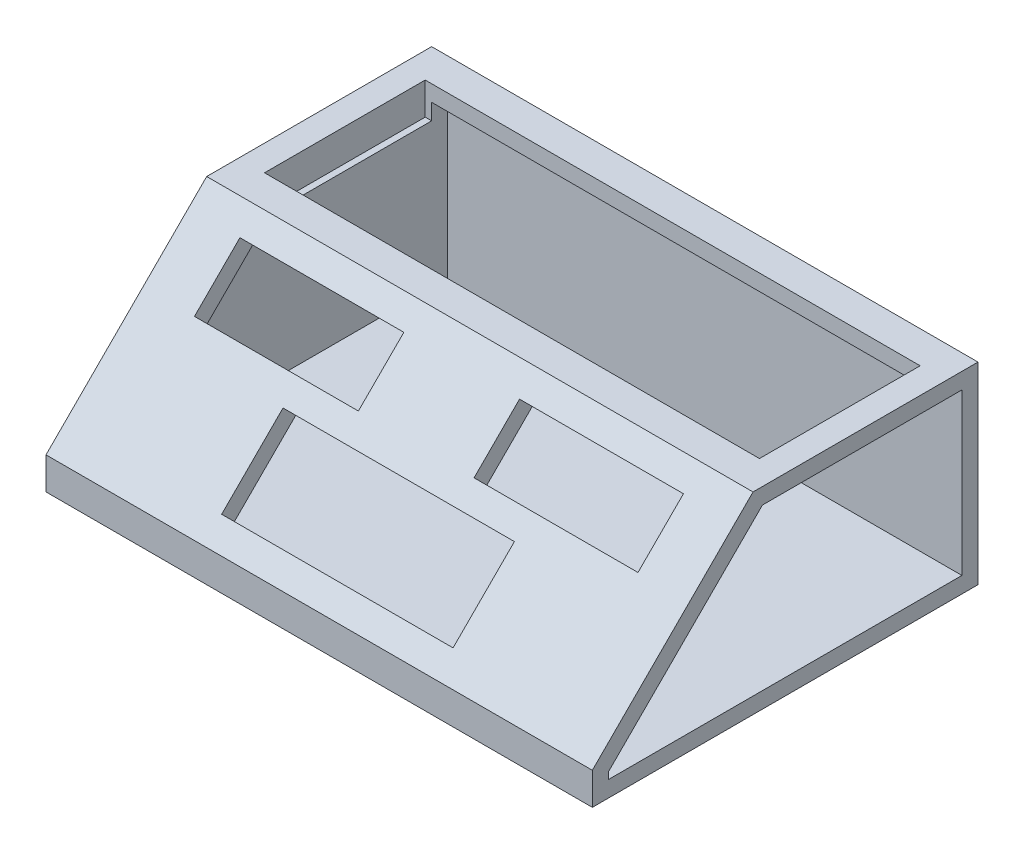
ISO-10303-21;
HEADER;
FILE_DESCRIPTION(('STEP AP214'),'2;1');
FILE_NAME('part.step','',(''),(''),'','','');
FILE_SCHEMA(('AUTOMOTIVE_DESIGN { 1 0 10303 214 1 1 1 1 }'));
ENDSEC;
DATA;
#1=APPLICATION_CONTEXT('core data for automotive mechanical design processes');
#2=APPLICATION_PROTOCOL_DEFINITION('international standard','automotive_design',2000,#1);
#3=PRODUCT_CONTEXT('',#1,'mechanical');
#4=PRODUCT('Part','Part','',(#3));
#5=PRODUCT_RELATED_PRODUCT_CATEGORY('part','',(#4));
#6=PRODUCT_DEFINITION_FORMATION('','',#4);
#7=PRODUCT_DEFINITION_CONTEXT('part definition',#1,'design');
#8=PRODUCT_DEFINITION('design','',#6,#7);
#9=PRODUCT_DEFINITION_SHAPE('','',#8);
#10=(LENGTH_UNIT() NAMED_UNIT(*) SI_UNIT(.MILLI.,.METRE.));
#11=(NAMED_UNIT(*) PLANE_ANGLE_UNIT() SI_UNIT($,.RADIAN.));
#12=(NAMED_UNIT(*) SI_UNIT($,.STERADIAN.) SOLID_ANGLE_UNIT());
#13=UNCERTAINTY_MEASURE_WITH_UNIT(LENGTH_MEASURE(1.E-05),#10,'distance_accuracy_value','');
#14=(GEOMETRIC_REPRESENTATION_CONTEXT(3) GLOBAL_UNCERTAINTY_ASSIGNED_CONTEXT((#13)) GLOBAL_UNIT_ASSIGNED_CONTEXT((#10,
#11,#12)) REPRESENTATION_CONTEXT('',''));
#15=CARTESIAN_POINT('',(0.,0.,0.));
#16=DIRECTION('',(0.,0.,1.));
#17=DIRECTION('',(1.,0.,0.));
#18=AXIS2_PLACEMENT_3D('',#15,#16,#17);
#19=CARTESIAN_POINT('',(0.,18.1393825594359,0.));
#20=DIRECTION('',(0.,1.,0.));
#21=DIRECTION('',(0.,0.,1.));
#22=AXIS2_PLACEMENT_3D('',#19,#20,#21);
#23=PLANE('',#22);
#24=DIRECTION('',(1.,0.,0.));
#25=VECTOR('',#24,1.);
#26=CARTESIAN_POINT('',(8.00000000000001,18.1393825594359,44.3239706504555));
#27=LINE('',#26,#25);
#28=CARTESIAN_POINT('',(8.00000000000001,18.1393825594359,44.3239706504555));
#29=VERTEX_POINT('',#28);
#30=CARTESIAN_POINT('',(10.,18.1393825594359,44.3239706504555));
#31=VERTEX_POINT('',#30);
#32=EDGE_CURVE('E343',#29,#31,#27,.T.);
#33=ORIENTED_EDGE('',*,*,#32,.T.);
#34=DIRECTION('',(0.,0.,-1.));
#35=VECTOR('',#34,1.);
#36=CARTESIAN_POINT('',(10.,18.1393825594359,0.));
#37=LINE('',#36,#35);
#38=CARTESIAN_POINT('',(10.,18.1393825594359,-5.67602934954452));
#39=VERTEX_POINT('',#38);
#40=EDGE_CURVE('E404',#31,#39,#37,.T.);
#41=ORIENTED_EDGE('',*,*,#40,.T.);
#42=DIRECTION('',(-1.,0.,0.));
#43=VECTOR('',#42,1.);
#44=CARTESIAN_POINT('',(8.,18.1393825594359,-5.67602934954452));
#45=LINE('',#44,#43);
#46=CARTESIAN_POINT('',(8.,18.1393825594359,-5.67602934954452));
#47=VERTEX_POINT('',#46);
#48=EDGE_CURVE('E347',#39,#47,#45,.T.);
#49=ORIENTED_EDGE('',*,*,#48,.T.);
#50=DIRECTION('',(0.,0.,1.));
#51=VECTOR('',#50,1.);
#52=CARTESIAN_POINT('',(8.,18.1393825594359,-5.67602934954452));
#53=LINE('',#52,#51);
#54=EDGE_CURVE('E340',#47,#29,#53,.T.);
#55=ORIENTED_EDGE('',*,*,#54,.T.);
#56=EDGE_LOOP('',(#33,#41,#49,#55));
#57=FACE_BOUND('',#56,.T.);
#58=ADVANCED_FACE('F33',(#57),#23,.T.);
#59=CARTESIAN_POINT('',(170.,-21.8606174405641,104.323970650455));
#60=DIRECTION('',(0.,-0.707106781186547,-0.707106781186548));
#61=DIRECTION('',(0.,0.707106781186548,-0.707106781186547));
#62=AXIS2_PLACEMENT_3D('',#59,#60,#61);
#63=PLANE('',#62);
#64=DIRECTION('',(1.,0.,0.));
#65=VECTOR('',#64,1.);
#66=CARTESIAN_POINT('',(103.,8.34039268621256,74.1229605236788));
#67=LINE('',#66,#65);
#68=CARTESIAN_POINT('',(103.,8.34039268621257,74.1229605236788));
#69=VERTEX_POINT('',#68);
#70=CARTESIAN_POINT('',(154.,8.34039268621256,74.1229605236788));
#71=VERTEX_POINT('',#70);
#72=EDGE_CURVE('E251',#69,#71,#67,.T.);
#73=ORIENTED_EDGE('',*,*,#72,.F.);
#74=DIRECTION('',(0.,-0.707106781186548,0.707106781186547));
#75=VECTOR('',#74,1.);
#76=CARTESIAN_POINT('',(103.,22.4825283099435,59.9808248999479));
#77=LINE('',#76,#75);
#78=CARTESIAN_POINT('',(103.,22.4825283099435,59.9808248999479));
#79=VERTEX_POINT('',#78);
#80=EDGE_CURVE('E48',#79,#69,#77,.T.);
#81=ORIENTED_EDGE('',*,*,#80,.F.);
#82=DIRECTION('',(-1.,0.,0.));
#83=VECTOR('',#82,1.);
#84=CARTESIAN_POINT('',(103.,22.4825283099435,59.9808248999479));
#85=LINE('',#84,#83);
#86=CARTESIAN_POINT('',(154.,22.4825283099435,59.9808248999479));
#87=VERTEX_POINT('',#86);
#88=EDGE_CURVE('E257',#87,#79,#85,.T.);
#89=ORIENTED_EDGE('',*,*,#88,.F.);
#90=DIRECTION('',(0.,0.707106781186548,-0.707106781186547));
#91=VECTOR('',#90,1.);
#92=CARTESIAN_POINT('',(154.,22.4825283099435,59.9808248999479));
#93=LINE('',#92,#91);
#94=EDGE_CURVE('E254',#71,#87,#93,.T.);
#95=ORIENTED_EDGE('',*,*,#94,.F.);
#96=EDGE_LOOP('',(#73,#81,#89,#95));
#97=FACE_BOUND('',#96,.T.);
#98=DIRECTION('',(1.,0.,0.));
#99=VECTOR('',#98,1.);
#100=CARTESIAN_POINT('',(49.,-16.2037631910717,98.6671164009631));
#101=LINE('',#100,#99);
#102=CARTESIAN_POINT('',(49.,-16.2037631910717,98.6671164009631));
#103=VERTEX_POINT('',#102);
#104=CARTESIAN_POINT('',(121.,-16.2037631910717,98.6671164009631));
#105=VERTEX_POINT('',#104);
#106=EDGE_CURVE('E235',#103,#105,#101,.T.);
#107=ORIENTED_EDGE('',*,*,#106,.F.);
#108=DIRECTION('',(0.,-0.707106781186547,0.707106781186547));
#109=VECTOR('',#108,1.);
#110=CARTESIAN_POINT('',(49.,2.88811990096507,79.5752333089263));
#111=LINE('',#110,#109);
#112=CARTESIAN_POINT('',(49.,2.88811990096507,79.5752333089263));
#113=VERTEX_POINT('',#112);
#114=EDGE_CURVE('E56',#113,#103,#111,.T.);
#115=ORIENTED_EDGE('',*,*,#114,.F.);
#116=DIRECTION('',(-1.,0.,0.));
#117=VECTOR('',#116,1.);
#118=CARTESIAN_POINT('',(49.,2.88811990096507,79.5752333089263));
#119=LINE('',#118,#117);
#120=CARTESIAN_POINT('',(121.,2.88811990096507,79.5752333089263));
#121=VERTEX_POINT('',#120);
#122=EDGE_CURVE('E241',#121,#113,#119,.T.);
#123=ORIENTED_EDGE('',*,*,#122,.F.);
#124=DIRECTION('',(0.,0.707106781186547,-0.707106781186547));
#125=VECTOR('',#124,1.);
#126=CARTESIAN_POINT('',(121.,2.88811990096507,79.5752333089263));
#127=LINE('',#126,#125);
#128=EDGE_CURVE('E225',#105,#121,#127,.T.);
#129=ORIENTED_EDGE('',*,*,#128,.F.);
#130=EDGE_LOOP('',(#107,#115,#123,#129));
#131=FACE_BOUND('',#130,.T.);
#132=DIRECTION('',(1.,0.,0.));
#133=VECTOR('',#132,1.);
#134=CARTESIAN_POINT('',(16.,8.34039268621256,74.1229605236788));
#135=LINE('',#134,#133);
#136=CARTESIAN_POINT('',(16.,8.34039268621257,74.1229605236788));
#137=VERTEX_POINT('',#136);
#138=CARTESIAN_POINT('',(67.,8.34039268621256,74.1229605236788));
#139=VERTEX_POINT('',#138);
#140=EDGE_CURVE('E270',#137,#139,#135,.T.);
#141=ORIENTED_EDGE('',*,*,#140,.F.);
#142=DIRECTION('',(0.,-0.707106781186548,0.707106781186547));
#143=VECTOR('',#142,1.);
#144=CARTESIAN_POINT('',(16.,22.4825283099435,59.9808248999479));
#145=LINE('',#144,#143);
#146=CARTESIAN_POINT('',(16.,22.4825283099435,59.9808248999479));
#147=VERTEX_POINT('',#146);
#148=EDGE_CURVE('E263',#147,#137,#145,.T.);
#149=ORIENTED_EDGE('',*,*,#148,.F.);
#150=DIRECTION('',(-1.,0.,0.));
#151=VECTOR('',#150,1.);
#152=CARTESIAN_POINT('',(16.,22.4825283099435,59.9808248999479));
#153=LINE('',#152,#151);
#154=CARTESIAN_POINT('',(67.,22.4825283099435,59.9808248999479));
#155=VERTEX_POINT('',#154);
#156=EDGE_CURVE('E276',#155,#147,#153,.T.);
#157=ORIENTED_EDGE('',*,*,#156,.F.);
#158=DIRECTION('',(0.,0.707106781186548,-0.707106781186547));
#159=VECTOR('',#158,1.);
#160=CARTESIAN_POINT('',(67.,22.4825283099435,59.9808248999479));
#161=LINE('',#160,#159);
#162=EDGE_CURVE('E273',#139,#155,#161,.T.);
#163=ORIENTED_EDGE('',*,*,#162,.F.);
#164=EDGE_LOOP('',(#141,#149,#157,#163));
#165=FACE_BOUND('',#164,.T.);
#166=DIRECTION('',(0.,-0.707106781186548,0.707106781186547));
#167=VECTOR('',#166,1.);
#168=CARTESIAN_POINT('',(0.,-21.8606174405641,104.323970650455));
#169=LINE('',#168,#167);
#170=CARTESIAN_POINT('',(0.,28.1393825594359,54.3239706504555));
#171=VERTEX_POINT('',#170);
#172=CARTESIAN_POINT('',(0.,-21.8606174405641,104.323970650455));
#173=VERTEX_POINT('',#172);
#174=EDGE_CURVE('E361',#171,#173,#169,.T.);
#175=ORIENTED_EDGE('',*,*,#174,.T.);
#176=DIRECTION('',(-1.,0.,0.));
#177=VECTOR('',#176,1.);
#178=CARTESIAN_POINT('',(170.,-21.8606174405641,104.323970650455));
#179=LINE('',#178,#177);
#180=CARTESIAN_POINT('',(170.,-21.8606174405641,104.323970650455));
#181=VERTEX_POINT('',#180);
#182=EDGE_CURVE('E401',#181,#173,#179,.T.);
#183=ORIENTED_EDGE('',*,*,#182,.F.);
#184=DIRECTION('',(0.,-0.707106781186548,0.707106781186547));
#185=VECTOR('',#184,1.);
#186=CARTESIAN_POINT('',(170.,-21.8606174405641,104.323970650455));
#187=LINE('',#186,#185);
#188=CARTESIAN_POINT('',(170.,28.1393825594359,54.3239706504555));
#189=VERTEX_POINT('',#188);
#190=EDGE_CURVE('E368',#189,#181,#187,.T.);
#191=ORIENTED_EDGE('',*,*,#190,.F.);
#192=DIRECTION('',(-1.,0.,0.));
#193=VECTOR('',#192,1.);
#194=CARTESIAN_POINT('',(170.,28.1393825594359,54.3239706504555));
#195=LINE('',#194,#193);
#196=EDGE_CURVE('E380',#189,#171,#195,.T.);
#197=ORIENTED_EDGE('',*,*,#196,.T.);
#198=EDGE_LOOP('',(#175,#183,#191,#197));
#199=FACE_BOUND('',#198,.T.);
#200=ADVANCED_FACE('F35',(#97,#131,#165,#199),#63,.F.);
#201=CARTESIAN_POINT('',(170.,-31.8606174405641,104.323970650455));
#202=DIRECTION('',(0.,0.,-1.));
#203=DIRECTION('',(-1.,0.,0.));
#204=AXIS2_PLACEMENT_3D('',#201,#202,#203);
#205=PLANE('',#204);
#206=DIRECTION('',(0.,-1.,0.));
#207=VECTOR('',#206,1.);
#208=CARTESIAN_POINT('',(0.,-31.8606174405641,104.323970650455));
#209=LINE('',#208,#207);
#210=CARTESIAN_POINT('',(0.,-31.8606174405641,104.323970650455));
#211=VERTEX_POINT('',#210);
#212=EDGE_CURVE('E383',#173,#211,#209,.T.);
#213=ORIENTED_EDGE('',*,*,#212,.T.);
#214=DIRECTION('',(-1.,0.,0.));
#215=VECTOR('',#214,1.);
#216=CARTESIAN_POINT('',(170.,-31.8606174405641,104.323970650455));
#217=LINE('',#216,#215);
#218=CARTESIAN_POINT('',(170.,-31.8606174405641,104.323970650455));
#219=VERTEX_POINT('',#218);
#220=EDGE_CURVE('E398',#219,#211,#217,.T.);
#221=ORIENTED_EDGE('',*,*,#220,.F.);
#222=DIRECTION('',(0.,-1.,0.));
#223=VECTOR('',#222,1.);
#224=CARTESIAN_POINT('',(170.,-31.8606174405641,104.323970650455));
#225=LINE('',#224,#223);
#226=EDGE_CURVE('E371',#181,#219,#225,.T.);
#227=ORIENTED_EDGE('',*,*,#226,.F.);
#228=ORIENTED_EDGE('',*,*,#182,.T.);
#229=EDGE_LOOP('',(#213,#221,#227,#228));
#230=FACE_BOUND('',#229,.T.);
#231=ADVANCED_FACE('F470',(#230),#205,.F.);
#232=CARTESIAN_POINT('',(170.,-31.8606174405641,-15.6760293495445));
#233=DIRECTION('',(0.,1.,0.));
#234=DIRECTION('',(0.,0.,1.));
#235=AXIS2_PLACEMENT_3D('',#232,#233,#234);
#236=PLANE('',#235);
#237=DIRECTION('',(0.,0.,-1.));
#238=VECTOR('',#237,1.);
#239=CARTESIAN_POINT('',(0.,-31.8606174405641,-15.6760293495445));
#240=LINE('',#239,#238);
#241=CARTESIAN_POINT('',(0.,-31.8606174405641,-15.6760293495445));
#242=VERTEX_POINT('',#241);
#243=EDGE_CURVE('E385',#211,#242,#240,.T.);
#244=ORIENTED_EDGE('',*,*,#243,.T.);
#245=DIRECTION('',(-1.,0.,0.));
#246=VECTOR('',#245,1.);
#247=CARTESIAN_POINT('',(170.,-31.8606174405641,-15.6760293495445));
#248=LINE('',#247,#246);
#249=CARTESIAN_POINT('',(170.,-31.8606174405641,-15.6760293495445));
#250=VERTEX_POINT('',#249);
#251=EDGE_CURVE('E395',#250,#242,#248,.T.);
#252=ORIENTED_EDGE('',*,*,#251,.F.);
#253=DIRECTION('',(0.,0.,-1.));
#254=VECTOR('',#253,1.);
#255=CARTESIAN_POINT('',(170.,-31.8606174405641,-15.6760293495445));
#256=LINE('',#255,#254);
#257=EDGE_CURVE('E374',#219,#250,#256,.T.);
#258=ORIENTED_EDGE('',*,*,#257,.F.);
#259=ORIENTED_EDGE('',*,*,#220,.T.);
#260=EDGE_LOOP('',(#244,#252,#258,#259));
#261=FACE_BOUND('',#260,.T.);
#262=ADVANCED_FACE('F506',(#261),#236,.F.);
#263=CARTESIAN_POINT('',(170.,28.1393825594359,-15.6760293495445));
#264=DIRECTION('',(0.,0.,1.));
#265=DIRECTION('',(0.,-1.,0.));
#266=AXIS2_PLACEMENT_3D('',#263,#264,#265);
#267=PLANE('',#266);
#268=DIRECTION('',(0.,1.,0.));
#269=VECTOR('',#268,1.);
#270=CARTESIAN_POINT('',(0.,28.1393825594359,-15.6760293495445));
#271=LINE('',#270,#269);
#272=CARTESIAN_POINT('',(0.,28.1393825594359,-15.6760293495445));
#273=VERTEX_POINT('',#272);
#274=EDGE_CURVE('E387',#242,#273,#271,.T.);
#275=ORIENTED_EDGE('',*,*,#274,.T.);
#276=DIRECTION('',(-1.,0.,0.));
#277=VECTOR('',#276,1.);
#278=CARTESIAN_POINT('',(170.,28.1393825594359,-15.6760293495445));
#279=LINE('',#278,#277);
#280=CARTESIAN_POINT('',(170.,28.1393825594359,-15.6760293495445));
#281=VERTEX_POINT('',#280);
#282=EDGE_CURVE('E392',#281,#273,#279,.T.);
#283=ORIENTED_EDGE('',*,*,#282,.F.);
#284=DIRECTION('',(0.,1.,0.));
#285=VECTOR('',#284,1.);
#286=CARTESIAN_POINT('',(170.,28.1393825594359,-15.6760293495445));
#287=LINE('',#286,#285);
#288=EDGE_CURVE('E376',#250,#281,#287,.T.);
#289=ORIENTED_EDGE('',*,*,#288,.F.);
#290=ORIENTED_EDGE('',*,*,#251,.T.);
#291=EDGE_LOOP('',(#275,#283,#289,#290));
#292=FACE_BOUND('',#291,.T.);
#293=ADVANCED_FACE('F502',(#292),#267,.F.);
#294=CARTESIAN_POINT('',(170.,28.1393825594359,54.3239706504555));
#295=DIRECTION('',(0.,-1.,0.));
#296=DIRECTION('',(0.,0.,-1.));
#297=AXIS2_PLACEMENT_3D('',#294,#295,#296);
#298=PLANE('',#297);
#299=DIRECTION('',(1.,0.,0.));
#300=VECTOR('',#299,1.);
#301=CARTESIAN_POINT('',(8.00000000000001,28.1393825594359,44.3239706504555));
#302=LINE('',#301,#300);
#303=CARTESIAN_POINT('',(8.00000000000001,28.1393825594359,44.3239706504555));
#304=VERTEX_POINT('',#303);
#305=CARTESIAN_POINT('',(162.,28.1393825594359,44.3239706504555));
#306=VERTEX_POINT('',#305);
#307=EDGE_CURVE('E351',#304,#306,#302,.T.);
#308=ORIENTED_EDGE('',*,*,#307,.F.);
#309=DIRECTION('',(0.,0.,1.));
#310=VECTOR('',#309,1.);
#311=CARTESIAN_POINT('',(8.,28.1393825594359,-5.67602934954452));
#312=LINE('',#311,#310);
#313=CARTESIAN_POINT('',(8.,28.1393825594359,-5.67602934954452));
#314=VERTEX_POINT('',#313);
#315=EDGE_CURVE('E339',#314,#304,#312,.T.);
#316=ORIENTED_EDGE('',*,*,#315,.F.);
#317=DIRECTION('',(-1.,0.,0.));
#318=VECTOR('',#317,1.);
#319=CARTESIAN_POINT('',(8.,28.1393825594359,-5.67602934954452));
#320=LINE('',#319,#318);
#321=CARTESIAN_POINT('',(162.,28.1393825594359,-5.67602934954452));
#322=VERTEX_POINT('',#321);
#323=EDGE_CURVE('E344',#322,#314,#320,.T.);
#324=ORIENTED_EDGE('',*,*,#323,.F.);
#325=DIRECTION('',(0.,0.,-1.));
#326=VECTOR('',#325,1.);
#327=CARTESIAN_POINT('',(162.,28.1393825594359,-5.67602934954452));
#328=LINE('',#327,#326);
#329=EDGE_CURVE('E354',#306,#322,#328,.T.);
#330=ORIENTED_EDGE('',*,*,#329,.F.);
#331=EDGE_LOOP('',(#308,#316,#324,#330));
#332=FACE_BOUND('',#331,.T.);
#333=DIRECTION('',(0.,0.,1.));
#334=VECTOR('',#333,1.);
#335=CARTESIAN_POINT('',(0.,28.1393825594359,54.3239706504555));
#336=LINE('',#335,#334);
#337=EDGE_CURVE('E372',#273,#171,#336,.T.);
#338=ORIENTED_EDGE('',*,*,#337,.T.);
#339=ORIENTED_EDGE('',*,*,#196,.F.);
#340=DIRECTION('',(0.,0.,1.));
#341=VECTOR('',#340,1.);
#342=CARTESIAN_POINT('',(170.,28.1393825594359,54.3239706504555));
#343=LINE('',#342,#341);
#344=EDGE_CURVE('E378',#281,#189,#343,.T.);
#345=ORIENTED_EDGE('',*,*,#344,.F.);
#346=ORIENTED_EDGE('',*,*,#282,.T.);
#347=EDGE_LOOP('',(#338,#339,#345,#346));
#348=FACE_BOUND('',#347,.T.);
#349=ADVANCED_FACE('F495',(#332,#348),#298,.F.);
#350=CARTESIAN_POINT('',(170.,0.,0.));
#351=DIRECTION('',(-1.,0.,0.));
#352=DIRECTION('',(0.,0.,1.));
#353=AXIS2_PLACEMENT_3D('',#350,#351,#352);
#354=PLANE('',#353);
#355=DIRECTION('',(0.,-1.,0.));
#356=VECTOR('',#355,1.);
#357=CARTESIAN_POINT('',(170.,-24.7821574610261,99.3239706504555));
#358=LINE('',#357,#356);
#359=CARTESIAN_POINT('',(170.,-24.7821574610261,99.3239706504555));
#360=VERTEX_POINT('',#359);
#361=CARTESIAN_POINT('',(170.,-26.8606174405641,99.3239706504555));
#362=VERTEX_POINT('',#361);
#363=EDGE_CURVE('E308',#360,#362,#358,.T.);
#364=ORIENTED_EDGE('',*,*,#363,.F.);
#365=DIRECTION('',(0.,-0.707106781186554,0.707106781186541));
#366=VECTOR('',#365,1.);
#367=CARTESIAN_POINT('',(170.,23.1393825594359,51.4024306299943));
#368=LINE('',#367,#366);
#369=CARTESIAN_POINT('',(170.,23.1393825594359,51.4024306299943));
#370=VERTEX_POINT('',#369);
#371=EDGE_CURVE('E282',#370,#360,#368,.T.);
#372=ORIENTED_EDGE('',*,*,#371,.F.);
#373=DIRECTION('',(0.,0.,1.));
#374=VECTOR('',#373,1.);
#375=CARTESIAN_POINT('',(170.,23.1393825594359,51.4024306299943));
#376=LINE('',#375,#374);
#377=CARTESIAN_POINT('',(170.,23.1393825594359,-10.6760293495445));
#378=VERTEX_POINT('',#377);
#379=EDGE_CURVE('E293',#378,#370,#376,.T.);
#380=ORIENTED_EDGE('',*,*,#379,.F.);
#381=DIRECTION('',(0.,1.,0.));
#382=VECTOR('',#381,1.);
#383=CARTESIAN_POINT('',(170.,23.1393825594359,-10.6760293495445));
#384=LINE('',#383,#382);
#385=CARTESIAN_POINT('',(170.,-26.8606174405641,-10.6760293495445));
#386=VERTEX_POINT('',#385);
#387=EDGE_CURVE('E314',#386,#378,#384,.T.);
#388=ORIENTED_EDGE('',*,*,#387,.F.);
#389=DIRECTION('',(0.,0.,-1.));
#390=VECTOR('',#389,1.);
#391=CARTESIAN_POINT('',(170.,-26.8606174405641,-10.6760293495445));
#392=LINE('',#391,#390);
#393=EDGE_CURVE('E311',#362,#386,#392,.T.);
#394=ORIENTED_EDGE('',*,*,#393,.F.);
#395=EDGE_LOOP('',(#364,#372,#380,#388,#394));
#396=FACE_BOUND('',#395,.T.);
#397=ORIENTED_EDGE('',*,*,#190,.T.);
#398=ORIENTED_EDGE('',*,*,#226,.T.);
#399=ORIENTED_EDGE('',*,*,#257,.T.);
#400=ORIENTED_EDGE('',*,*,#288,.T.);
#401=ORIENTED_EDGE('',*,*,#344,.T.);
#402=EDGE_LOOP('',(#397,#398,#399,#400,#401));
#403=FACE_BOUND('',#402,.T.);
#404=ADVANCED_FACE('F492',(#396,#403),#354,.F.);
#405=CARTESIAN_POINT('',(0.,0.,0.));
#406=DIRECTION('',(-1.,0.,0.));
#407=DIRECTION('',(0.,0.,1.));
#408=AXIS2_PLACEMENT_3D('',#405,#406,#407);
#409=PLANE('',#408);
#410=ORIENTED_EDGE('',*,*,#174,.F.);
#411=ORIENTED_EDGE('',*,*,#337,.F.);
#412=ORIENTED_EDGE('',*,*,#274,.F.);
#413=ORIENTED_EDGE('',*,*,#243,.F.);
#414=ORIENTED_EDGE('',*,*,#212,.F.);
#415=EDGE_LOOP('',(#410,#411,#412,#413,#414));
#416=FACE_BOUND('',#415,.T.);
#417=ADVANCED_FACE('F490',(#416),#409,.T.);
#418=CARTESIAN_POINT('',(8.,18.1393825594359,-5.67602934954452));
#419=DIRECTION('',(-1.,0.,0.));
#420=DIRECTION('',(0.,0.,1.));
#421=AXIS2_PLACEMENT_3D('',#418,#419,#420);
#422=PLANE('',#421);
#423=ORIENTED_EDGE('',*,*,#315,.T.);
#424=DIRECTION('',(0.,1.,0.));
#425=VECTOR('',#424,1.);
#426=CARTESIAN_POINT('',(8.00000000000001,18.1393825594359,44.3239706504555));
#427=LINE('',#426,#425);
#428=EDGE_CURVE('E349',#29,#304,#427,.T.);
#429=ORIENTED_EDGE('',*,*,#428,.F.);
#430=ORIENTED_EDGE('',*,*,#54,.F.);
#431=DIRECTION('',(0.,1.,0.));
#432=VECTOR('',#431,1.);
#433=CARTESIAN_POINT('',(8.,18.1393825594359,-5.67602934954452));
#434=LINE('',#433,#432);
#435=EDGE_CURVE('E359',#47,#314,#434,.T.);
#436=ORIENTED_EDGE('',*,*,#435,.T.);
#437=EDGE_LOOP('',(#423,#429,#430,#436));
#438=FACE_BOUND('',#437,.T.);
#439=ADVANCED_FACE('F478',(#438),#422,.F.);
#440=CARTESIAN_POINT('',(8.,18.1393825594359,-5.67602934954452));
#441=DIRECTION('',(0.,0.,-1.));
#442=DIRECTION('',(-1.,0.,0.));
#443=AXIS2_PLACEMENT_3D('',#440,#441,#442);
#444=PLANE('',#443);
#445=DIRECTION('',(0.,-1.,0.));
#446=VECTOR('',#445,1.);
#447=CARTESIAN_POINT('',(10.,18.1393825594359,-5.67602934954452));
#448=LINE('',#447,#446);
#449=CARTESIAN_POINT('',(10.,23.1393825594359,-5.67602934954452));
#450=VERTEX_POINT('',#449);
#451=EDGE_CURVE('E331',#450,#39,#448,.T.);
#452=ORIENTED_EDGE('',*,*,#451,.F.);
#453=DIRECTION('',(1.,0.,0.));
#454=VECTOR('',#453,1.);
#455=CARTESIAN_POINT('',(8.,23.1393825594359,-5.67602934954452));
#456=LINE('',#455,#454);
#457=CARTESIAN_POINT('',(162.,23.1393825594359,-5.67602934954452));
#458=VERTEX_POINT('',#457);
#459=EDGE_CURVE('E336',#450,#458,#456,.T.);
#460=ORIENTED_EDGE('',*,*,#459,.T.);
#461=DIRECTION('',(0.,1.,0.));
#462=VECTOR('',#461,1.);
#463=CARTESIAN_POINT('',(162.,18.1393825594359,-5.67602934954452));
#464=LINE('',#463,#462);
#465=EDGE_CURVE('E362',#458,#322,#464,.T.);
#466=ORIENTED_EDGE('',*,*,#465,.T.);
#467=ORIENTED_EDGE('',*,*,#323,.T.);
#468=ORIENTED_EDGE('',*,*,#435,.F.);
#469=ORIENTED_EDGE('',*,*,#48,.F.);
#470=EDGE_LOOP('',(#452,#460,#466,#467,#468,#469));
#471=FACE_BOUND('',#470,.T.);
#472=ADVANCED_FACE('F474',(#471),#444,.F.);
#473=CARTESIAN_POINT('',(162.,18.1393825594359,-5.67602934954452));
#474=DIRECTION('',(1.,0.,0.));
#475=DIRECTION('',(0.,0.,-1.));
#476=AXIS2_PLACEMENT_3D('',#473,#474,#475);
#477=PLANE('',#476);
#478=ORIENTED_EDGE('',*,*,#465,.F.);
#479=DIRECTION('',(0.,0.,1.));
#480=VECTOR('',#479,1.);
#481=CARTESIAN_POINT('',(162.,23.1393825594359,-5.67602934954452));
#482=LINE('',#481,#480);
#483=CARTESIAN_POINT('',(162.,23.1393825594359,44.3239706504555));
#484=VERTEX_POINT('',#483);
#485=EDGE_CURVE('E333',#458,#484,#482,.T.);
#486=ORIENTED_EDGE('',*,*,#485,.T.);
#487=DIRECTION('',(0.,1.,0.));
#488=VECTOR('',#487,1.);
#489=CARTESIAN_POINT('',(162.,18.1393825594359,44.3239706504555));
#490=LINE('',#489,#488);
#491=EDGE_CURVE('E364',#484,#306,#490,.T.);
#492=ORIENTED_EDGE('',*,*,#491,.T.);
#493=ORIENTED_EDGE('',*,*,#329,.T.);
#494=EDGE_LOOP('',(#478,#486,#492,#493));
#495=FACE_BOUND('',#494,.T.);
#496=ADVANCED_FACE('F477',(#495),#477,.F.);
#497=CARTESIAN_POINT('',(8.00000000000001,18.1393825594359,44.3239706504555));
#498=DIRECTION('',(0.,0.,1.));
#499=DIRECTION('',(1.,0.,0.));
#500=AXIS2_PLACEMENT_3D('',#497,#498,#499);
#501=PLANE('',#500);
#502=ORIENTED_EDGE('',*,*,#491,.F.);
#503=DIRECTION('',(-1.,0.,0.));
#504=VECTOR('',#503,1.);
#505=CARTESIAN_POINT('',(8.00000000000001,23.1393825594359,44.3239706504555));
#506=LINE('',#505,#504);
#507=CARTESIAN_POINT('',(10.,23.1393825594359,44.3239706504555));
#508=VERTEX_POINT('',#507);
#509=EDGE_CURVE('E407',#484,#508,#506,.T.);
#510=ORIENTED_EDGE('',*,*,#509,.T.);
#511=DIRECTION('',(0.,1.,0.));
#512=VECTOR('',#511,1.);
#513=CARTESIAN_POINT('',(10.,18.1393825594359,44.3239706504555));
#514=LINE('',#513,#512);
#515=EDGE_CURVE('E321',#31,#508,#514,.T.);
#516=ORIENTED_EDGE('',*,*,#515,.F.);
#517=ORIENTED_EDGE('',*,*,#32,.F.);
#518=ORIENTED_EDGE('',*,*,#428,.T.);
#519=ORIENTED_EDGE('',*,*,#307,.T.);
#520=EDGE_LOOP('',(#502,#510,#516,#517,#518,#519));
#521=FACE_BOUND('',#520,.T.);
#522=ADVANCED_FACE('F482',(#521),#501,.F.);
#523=CARTESIAN_POINT('',(10.,23.1393825594359,51.4024306299943));
#524=DIRECTION('',(0.,1.,0.));
#525=DIRECTION('',(0.,0.,1.));
#526=AXIS2_PLACEMENT_3D('',#523,#524,#525);
#527=PLANE('',#526);
#528=DIRECTION('',(0.,0.,1.));
#529=VECTOR('',#528,1.);
#530=CARTESIAN_POINT('',(10.,23.1393825594359,51.4024306299943));
#531=LINE('',#530,#529);
#532=CARTESIAN_POINT('',(10.,23.1393825594359,-10.6760293495445));
#533=VERTEX_POINT('',#532);
#534=EDGE_CURVE('E303',#533,#450,#531,.T.);
#535=ORIENTED_EDGE('',*,*,#534,.F.);
#536=DIRECTION('',(1.,0.,0.));
#537=VECTOR('',#536,1.);
#538=CARTESIAN_POINT('',(10.,23.1393825594359,-10.6760293495445));
#539=LINE('',#538,#537);
#540=EDGE_CURVE('E322',#533,#378,#539,.T.);
#541=ORIENTED_EDGE('',*,*,#540,.T.);
#542=ORIENTED_EDGE('',*,*,#379,.T.);
#543=DIRECTION('',(1.,0.,0.));
#544=VECTOR('',#543,1.);
#545=CARTESIAN_POINT('',(10.,23.1393825594359,51.4024306299943));
#546=LINE('',#545,#544);
#547=CARTESIAN_POINT('',(10.,23.1393825594359,51.4024306299943));
#548=VERTEX_POINT('',#547);
#549=EDGE_CURVE('E319',#548,#370,#546,.T.);
#550=ORIENTED_EDGE('',*,*,#549,.F.);
#551=EDGE_CURVE('E302',#508,#548,#531,.T.);
#552=ORIENTED_EDGE('',*,*,#551,.F.);
#553=ORIENTED_EDGE('',*,*,#509,.F.);
#554=ORIENTED_EDGE('',*,*,#485,.F.);
#555=ORIENTED_EDGE('',*,*,#459,.F.);
#556=EDGE_LOOP('',(#535,#541,#542,#550,#552,#553,#554,#555));
#557=FACE_BOUND('',#556,.T.);
#558=ADVANCED_FACE('F486',(#557),#527,.F.);
#559=CARTESIAN_POINT('',(10.,0.,0.));
#560=DIRECTION('',(1.,0.,0.));
#561=DIRECTION('',(0.,0.,-1.));
#562=AXIS2_PLACEMENT_3D('',#559,#560,#561);
#563=PLANE('',#562);
#564=ORIENTED_EDGE('',*,*,#451,.T.);
#565=ORIENTED_EDGE('',*,*,#40,.F.);
#566=ORIENTED_EDGE('',*,*,#515,.T.);
#567=ORIENTED_EDGE('',*,*,#551,.T.);
#568=DIRECTION('',(0.,-0.707106781186554,0.707106781186541));
#569=VECTOR('',#568,1.);
#570=CARTESIAN_POINT('',(10.,23.1393825594359,51.4024306299943));
#571=LINE('',#570,#569);
#572=CARTESIAN_POINT('',(10.,-24.7821574610261,99.3239706504555));
#573=VERTEX_POINT('',#572);
#574=EDGE_CURVE('E289',#548,#573,#571,.T.);
#575=ORIENTED_EDGE('',*,*,#574,.T.);
#576=DIRECTION('',(0.,-1.,0.));
#577=VECTOR('',#576,1.);
#578=CARTESIAN_POINT('',(10.,-24.7821574610261,99.3239706504555));
#579=LINE('',#578,#577);
#580=CARTESIAN_POINT('',(10.,-26.8606174405641,99.3239706504555));
#581=VERTEX_POINT('',#580);
#582=EDGE_CURVE('E292',#573,#581,#579,.T.);
#583=ORIENTED_EDGE('',*,*,#582,.T.);
#584=DIRECTION('',(0.,0.,-1.));
#585=VECTOR('',#584,1.);
#586=CARTESIAN_POINT('',(10.,-26.8606174405641,-10.6760293495445));
#587=LINE('',#586,#585);
#588=CARTESIAN_POINT('',(10.,-26.8606174405641,-10.6760293495445));
#589=VERTEX_POINT('',#588);
#590=EDGE_CURVE('E296',#581,#589,#587,.T.);
#591=ORIENTED_EDGE('',*,*,#590,.T.);
#592=DIRECTION('',(0.,1.,0.));
#593=VECTOR('',#592,1.);
#594=CARTESIAN_POINT('',(10.,23.1393825594359,-10.6760293495445));
#595=LINE('',#594,#593);
#596=EDGE_CURVE('E299',#589,#533,#595,.T.);
#597=ORIENTED_EDGE('',*,*,#596,.T.);
#598=ORIENTED_EDGE('',*,*,#534,.T.);
#599=EDGE_LOOP('',(#564,#565,#566,#567,#575,#583,#591,#597,#598));
#600=FACE_BOUND('',#599,.T.);
#601=ADVANCED_FACE('F574',(#600),#563,.T.);
#602=CARTESIAN_POINT('',(10.,23.1393825594359,51.4024306299943));
#603=DIRECTION('',(0.,0.707106781186541,0.707106781186554));
#604=DIRECTION('',(0.,-0.707106781186554,0.707106781186541));
#605=AXIS2_PLACEMENT_3D('',#602,#603,#604);
#606=PLANE('',#605);
#607=DIRECTION('',(-1.,0.,0.));
#608=VECTOR('',#607,1.);
#609=CARTESIAN_POINT('',(10.,18.5217582997129,56.0200548897172));
#610=LINE('',#609,#608);
#611=CARTESIAN_POINT('',(154.,18.5217582997129,56.0200548897172));
#612=VERTEX_POINT('',#611);
#613=CARTESIAN_POINT('',(103.,18.5217582997129,56.0200548897172));
#614=VERTEX_POINT('',#613);
#615=EDGE_CURVE('E41',#612,#614,#610,.T.);
#616=ORIENTED_EDGE('',*,*,#615,.T.);
#617=DIRECTION('',(0.,-0.707106781186554,0.707106781186541));
#618=VECTOR('',#617,1.);
#619=CARTESIAN_POINT('',(103.,23.1393825594359,51.4024306299943));
#620=LINE('',#619,#618);
#621=CARTESIAN_POINT('',(103.,4.37962267598183,70.1621905134481));
#622=VERTEX_POINT('',#621);
#623=EDGE_CURVE('E11',#614,#622,#620,.T.);
#624=ORIENTED_EDGE('',*,*,#623,.T.);
#625=DIRECTION('',(1.,0.,0.));
#626=VECTOR('',#625,1.);
#627=CARTESIAN_POINT('',(10.,4.37962267598183,70.1621905134481));
#628=LINE('',#627,#626);
#629=CARTESIAN_POINT('',(154.,4.37962267598183,70.1621905134481));
#630=VERTEX_POINT('',#629);
#631=EDGE_CURVE('E431',#622,#630,#628,.T.);
#632=ORIENTED_EDGE('',*,*,#631,.T.);
#633=DIRECTION('',(0.,0.707106781186554,-0.707106781186541));
#634=VECTOR('',#633,1.);
#635=CARTESIAN_POINT('',(154.,23.1393825594359,51.4024306299943));
#636=LINE('',#635,#634);
#637=EDGE_CURVE('E434',#630,#612,#636,.T.);
#638=ORIENTED_EDGE('',*,*,#637,.T.);
#639=EDGE_LOOP('',(#616,#624,#632,#638));
#640=FACE_BOUND('',#639,.T.);
#641=DIRECTION('',(-1.,0.,0.));
#642=VECTOR('',#641,1.);
#643=CARTESIAN_POINT('',(10.,-1.07265010926571,75.6144632986955));
#644=LINE('',#643,#642);
#645=CARTESIAN_POINT('',(121.,-1.07265010926571,75.6144632986955));
#646=VERTEX_POINT('',#645);
#647=CARTESIAN_POINT('',(49.,-1.07265010926571,75.6144632986955));
#648=VERTEX_POINT('',#647);
#649=EDGE_CURVE('E425',#646,#648,#644,.T.);
#650=ORIENTED_EDGE('',*,*,#649,.T.);
#651=DIRECTION('',(0.,-0.707106781186554,0.707106781186541));
#652=VECTOR('',#651,1.);
#653=CARTESIAN_POINT('',(49.,23.1393825594359,51.4024306299943));
#654=LINE('',#653,#652);
#655=CARTESIAN_POINT('',(49.,-20.1645332013027,94.7063463907321));
#656=VERTEX_POINT('',#655);
#657=EDGE_CURVE('E428',#648,#656,#654,.T.);
#658=ORIENTED_EDGE('',*,*,#657,.T.);
#659=DIRECTION('',(1.,0.,0.));
#660=VECTOR('',#659,1.);
#661=CARTESIAN_POINT('',(10.,-20.1645332013027,94.7063463907321));
#662=LINE('',#661,#660);
#663=CARTESIAN_POINT('',(121.,-20.1645332013027,94.7063463907321));
#664=VERTEX_POINT('',#663);
#665=EDGE_CURVE('E422',#656,#664,#662,.T.);
#666=ORIENTED_EDGE('',*,*,#665,.T.);
#667=DIRECTION('',(0.,0.707106781186554,-0.707106781186541));
#668=VECTOR('',#667,1.);
#669=CARTESIAN_POINT('',(121.,23.1393825594359,51.4024306299943));
#670=LINE('',#669,#668);
#671=EDGE_CURVE('E228',#664,#646,#670,.T.);
#672=ORIENTED_EDGE('',*,*,#671,.T.);
#673=EDGE_LOOP('',(#650,#658,#666,#672));
#674=FACE_BOUND('',#673,.T.);
#675=DIRECTION('',(-1.,0.,0.));
#676=VECTOR('',#675,1.);
#677=CARTESIAN_POINT('',(10.,18.5217582997129,56.0200548897172));
#678=LINE('',#677,#676);
#679=CARTESIAN_POINT('',(67.,18.5217582997129,56.0200548897172));
#680=VERTEX_POINT('',#679);
#681=CARTESIAN_POINT('',(16.,18.5217582997129,56.0200548897172));
#682=VERTEX_POINT('',#681);
#683=EDGE_CURVE('E416',#680,#682,#678,.T.);
#684=ORIENTED_EDGE('',*,*,#683,.T.);
#685=DIRECTION('',(0.,-0.707106781186554,0.707106781186541));
#686=VECTOR('',#685,1.);
#687=CARTESIAN_POINT('',(16.,23.1393825594359,51.4024306299943));
#688=LINE('',#687,#686);
#689=CARTESIAN_POINT('',(16.,4.37962267598183,70.1621905134481));
#690=VERTEX_POINT('',#689);
#691=EDGE_CURVE('E419',#682,#690,#688,.T.);
#692=ORIENTED_EDGE('',*,*,#691,.T.);
#693=DIRECTION('',(1.,0.,0.));
#694=VECTOR('',#693,1.);
#695=CARTESIAN_POINT('',(10.,4.37962267598183,70.1621905134481));
#696=LINE('',#695,#694);
#697=CARTESIAN_POINT('',(67.,4.37962267598183,70.1621905134481));
#698=VERTEX_POINT('',#697);
#699=EDGE_CURVE('E410',#690,#698,#696,.T.);
#700=ORIENTED_EDGE('',*,*,#699,.T.);
#701=DIRECTION('',(0.,0.707106781186554,-0.707106781186541));
#702=VECTOR('',#701,1.);
#703=CARTESIAN_POINT('',(67.,23.1393825594359,51.4024306299943));
#704=LINE('',#703,#702);
#705=EDGE_CURVE('E413',#698,#680,#704,.T.);
#706=ORIENTED_EDGE('',*,*,#705,.T.);
#707=EDGE_LOOP('',(#684,#692,#700,#706));
#708=FACE_BOUND('',#707,.T.);
#709=ORIENTED_EDGE('',*,*,#371,.T.);
#710=DIRECTION('',(1.,0.,0.));
#711=VECTOR('',#710,1.);
#712=CARTESIAN_POINT('',(10.,-24.7821574610261,99.3239706504555));
#713=LINE('',#712,#711);
#714=EDGE_CURVE('E306',#573,#360,#713,.T.);
#715=ORIENTED_EDGE('',*,*,#714,.F.);
#716=ORIENTED_EDGE('',*,*,#574,.F.);
#717=ORIENTED_EDGE('',*,*,#549,.T.);
#718=EDGE_LOOP('',(#709,#715,#716,#717));
#719=FACE_BOUND('',#718,.T.);
#720=ADVANCED_FACE('F438',(#640,#674,#708,#719),#606,.F.);
#721=CARTESIAN_POINT('',(10.,23.1393825594359,-10.6760293495445));
#722=DIRECTION('',(0.,0.,-1.));
#723=DIRECTION('',(0.,1.,0.));
#724=AXIS2_PLACEMENT_3D('',#721,#722,#723);
#725=PLANE('',#724);
#726=ORIENTED_EDGE('',*,*,#387,.T.);
#727=ORIENTED_EDGE('',*,*,#540,.F.);
#728=ORIENTED_EDGE('',*,*,#596,.F.);
#729=DIRECTION('',(1.,0.,0.));
#730=VECTOR('',#729,1.);
#731=CARTESIAN_POINT('',(10.,-26.8606174405641,-10.6760293495445));
#732=LINE('',#731,#730);
#733=EDGE_CURVE('E324',#589,#386,#732,.T.);
#734=ORIENTED_EDGE('',*,*,#733,.T.);
#735=EDGE_LOOP('',(#726,#727,#728,#734));
#736=FACE_BOUND('',#735,.T.);
#737=ADVANCED_FACE('F590',(#736),#725,.F.);
#738=CARTESIAN_POINT('',(10.,-26.8606174405641,-10.6760293495445));
#739=DIRECTION('',(0.,-1.,0.));
#740=DIRECTION('',(0.,0.,-1.));
#741=AXIS2_PLACEMENT_3D('',#738,#739,#740);
#742=PLANE('',#741);
#743=ORIENTED_EDGE('',*,*,#393,.T.);
#744=ORIENTED_EDGE('',*,*,#733,.F.);
#745=ORIENTED_EDGE('',*,*,#590,.F.);
#746=DIRECTION('',(1.,0.,0.));
#747=VECTOR('',#746,1.);
#748=CARTESIAN_POINT('',(10.,-26.8606174405641,99.3239706504555));
#749=LINE('',#748,#747);
#750=EDGE_CURVE('E326',#581,#362,#749,.T.);
#751=ORIENTED_EDGE('',*,*,#750,.T.);
#752=EDGE_LOOP('',(#743,#744,#745,#751));
#753=FACE_BOUND('',#752,.T.);
#754=ADVANCED_FACE('F596',(#753),#742,.F.);
#755=CARTESIAN_POINT('',(10.,-24.7821574610261,99.3239706504555));
#756=DIRECTION('',(0.,0.,1.));
#757=DIRECTION('',(1.,0.,0.));
#758=AXIS2_PLACEMENT_3D('',#755,#756,#757);
#759=PLANE('',#758);
#760=ORIENTED_EDGE('',*,*,#363,.T.);
#761=ORIENTED_EDGE('',*,*,#750,.F.);
#762=ORIENTED_EDGE('',*,*,#582,.F.);
#763=ORIENTED_EDGE('',*,*,#714,.T.);
#764=EDGE_LOOP('',(#760,#761,#762,#763));
#765=FACE_BOUND('',#764,.T.);
#766=ADVANCED_FACE('F604',(#765),#759,.F.);
#767=CARTESIAN_POINT('',(16.,15.411460498078,52.9097570880824));
#768=DIRECTION('',(-1.,0.,0.));
#769=DIRECTION('',(0.,-1.,0.));
#770=AXIS2_PLACEMENT_3D('',#767,#768,#769);
#771=PLANE('',#770);
#772=DIRECTION('',(0.,0.707106781186547,0.707106781186548));
#773=VECTOR('',#772,1.);
#774=CARTESIAN_POINT('',(16.,15.411460498078,52.9097570880824));
#775=LINE('',#774,#773);
#776=EDGE_CURVE('E280',#682,#147,#775,.T.);
#777=ORIENTED_EDGE('',*,*,#776,.T.);
#778=ORIENTED_EDGE('',*,*,#148,.T.);
#779=DIRECTION('',(0.,0.707106781186547,0.707106781186548));
#780=VECTOR('',#779,1.);
#781=CARTESIAN_POINT('',(16.,1.26932487434709,67.0518927118133));
#782=LINE('',#781,#780);
#783=EDGE_CURVE('E279',#690,#137,#782,.T.);
#784=ORIENTED_EDGE('',*,*,#783,.F.);
#785=ORIENTED_EDGE('',*,*,#691,.F.);
#786=EDGE_LOOP('',(#777,#778,#784,#785));
#787=FACE_BOUND('',#786,.T.);
#788=ADVANCED_FACE('F612',(#787),#771,.F.);
#789=CARTESIAN_POINT('',(16.,15.411460498078,52.9097570880824));
#790=DIRECTION('',(0.,0.707106781186548,-0.707106781186547));
#791=DIRECTION('',(0.,0.707106781186547,0.707106781186548));
#792=AXIS2_PLACEMENT_3D('',#789,#790,#791);
#793=PLANE('',#792);
#794=DIRECTION('',(0.,0.707106781186547,0.707106781186548));
#795=VECTOR('',#794,1.);
#796=CARTESIAN_POINT('',(67.,15.411460498078,52.9097570880824));
#797=LINE('',#796,#795);
#798=EDGE_CURVE('E283',#680,#155,#797,.T.);
#799=ORIENTED_EDGE('',*,*,#798,.T.);
#800=ORIENTED_EDGE('',*,*,#156,.T.);
#801=ORIENTED_EDGE('',*,*,#776,.F.);
#802=ORIENTED_EDGE('',*,*,#683,.F.);
#803=EDGE_LOOP('',(#799,#800,#801,#802));
#804=FACE_BOUND('',#803,.T.);
#805=ADVANCED_FACE('F618',(#804),#793,.F.);
#806=CARTESIAN_POINT('',(67.,15.411460498078,52.9097570880824));
#807=DIRECTION('',(1.,0.,0.));
#808=DIRECTION('',(0.,0.,-1.));
#809=AXIS2_PLACEMENT_3D('',#806,#807,#808);
#810=PLANE('',#809);
#811=DIRECTION('',(0.,0.707106781186547,0.707106781186548));
#812=VECTOR('',#811,1.);
#813=CARTESIAN_POINT('',(67.,1.26932487434709,67.0518927118133));
#814=LINE('',#813,#812);
#815=EDGE_CURVE('E285',#698,#139,#814,.T.);
#816=ORIENTED_EDGE('',*,*,#815,.T.);
#817=ORIENTED_EDGE('',*,*,#162,.T.);
#818=ORIENTED_EDGE('',*,*,#798,.F.);
#819=ORIENTED_EDGE('',*,*,#705,.F.);
#820=EDGE_LOOP('',(#816,#817,#818,#819));
#821=FACE_BOUND('',#820,.T.);
#822=ADVANCED_FACE('F626',(#821),#810,.F.);
#823=CARTESIAN_POINT('',(16.,1.26932487434709,67.0518927118133));
#824=DIRECTION('',(0.,-0.707106781186548,0.707106781186547));
#825=DIRECTION('',(0.,-0.707106781186547,-0.707106781186548));
#826=AXIS2_PLACEMENT_3D('',#823,#824,#825);
#827=PLANE('',#826);
#828=ORIENTED_EDGE('',*,*,#783,.T.);
#829=ORIENTED_EDGE('',*,*,#140,.T.);
#830=ORIENTED_EDGE('',*,*,#815,.F.);
#831=ORIENTED_EDGE('',*,*,#699,.F.);
#832=EDGE_LOOP('',(#828,#829,#830,#831));
#833=FACE_BOUND('',#832,.T.);
#834=ADVANCED_FACE('F633',(#833),#827,.F.);
#835=CARTESIAN_POINT('',(49.,-4.1829479109004,72.5041654970608));
#836=DIRECTION('',(-1.,0.,0.));
#837=DIRECTION('',(0.,0.,1.));
#838=AXIS2_PLACEMENT_3D('',#835,#836,#837);
#839=PLANE('',#838);
#840=DIRECTION('',(0.,0.707106781186547,0.707106781186548));
#841=VECTOR('',#840,1.);
#842=CARTESIAN_POINT('',(49.,-4.1829479109004,72.5041654970608));
#843=LINE('',#842,#841);
#844=EDGE_CURVE('E246',#648,#113,#843,.T.);
#845=ORIENTED_EDGE('',*,*,#844,.T.);
#846=ORIENTED_EDGE('',*,*,#114,.T.);
#847=DIRECTION('',(0.,0.707106781186547,0.707106781186548));
#848=VECTOR('',#847,1.);
#849=CARTESIAN_POINT('',(49.,-23.2748310029372,91.5960485890976));
#850=LINE('',#849,#848);
#851=EDGE_CURVE('E232',#656,#103,#850,.T.);
#852=ORIENTED_EDGE('',*,*,#851,.F.);
#853=ORIENTED_EDGE('',*,*,#657,.F.);
#854=EDGE_LOOP('',(#845,#846,#852,#853));
#855=FACE_BOUND('',#854,.T.);
#856=ADVANCED_FACE('F641',(#855),#839,.F.);
#857=CARTESIAN_POINT('',(49.,-4.1829479109004,72.5041654970608));
#858=DIRECTION('',(0.,0.707106781186548,-0.707106781186547));
#859=DIRECTION('',(0.,0.707106781186547,0.707106781186548));
#860=AXIS2_PLACEMENT_3D('',#857,#858,#859);
#861=PLANE('',#860);
#862=DIRECTION('',(0.,0.707106781186547,0.707106781186548));
#863=VECTOR('',#862,1.);
#864=CARTESIAN_POINT('',(121.,-4.1829479109004,72.5041654970608));
#865=LINE('',#864,#863);
#866=EDGE_CURVE('E231',#646,#121,#865,.T.);
#867=ORIENTED_EDGE('',*,*,#866,.T.);
#868=ORIENTED_EDGE('',*,*,#122,.T.);
#869=ORIENTED_EDGE('',*,*,#844,.F.);
#870=ORIENTED_EDGE('',*,*,#649,.F.);
#871=EDGE_LOOP('',(#867,#868,#869,#870));
#872=FACE_BOUND('',#871,.T.);
#873=ADVANCED_FACE('F649',(#872),#861,.F.);
#874=CARTESIAN_POINT('',(121.,-4.1829479109004,72.5041654970608));
#875=DIRECTION('',(1.,0.,0.));
#876=DIRECTION('',(0.,0.,-1.));
#877=AXIS2_PLACEMENT_3D('',#874,#875,#876);
#878=PLANE('',#877);
#879=DIRECTION('',(0.,0.707106781186547,0.707106781186548));
#880=VECTOR('',#879,1.);
#881=CARTESIAN_POINT('',(121.,-23.2748310029372,91.5960485890976));
#882=LINE('',#881,#880);
#883=EDGE_CURVE('E220',#664,#105,#882,.T.);
#884=ORIENTED_EDGE('',*,*,#883,.T.);
#885=ORIENTED_EDGE('',*,*,#128,.T.);
#886=ORIENTED_EDGE('',*,*,#866,.F.);
#887=ORIENTED_EDGE('',*,*,#671,.F.);
#888=EDGE_LOOP('',(#884,#885,#886,#887));
#889=FACE_BOUND('',#888,.T.);
#890=ADVANCED_FACE('F222',(#889),#878,.F.);
#891=CARTESIAN_POINT('',(49.,-23.2748310029372,91.5960485890976));
#892=DIRECTION('',(0.,-0.707106781186548,0.707106781186547));
#893=DIRECTION('',(0.,-0.707106781186547,-0.707106781186548));
#894=AXIS2_PLACEMENT_3D('',#891,#892,#893);
#895=PLANE('',#894);
#896=ORIENTED_EDGE('',*,*,#851,.T.);
#897=ORIENTED_EDGE('',*,*,#106,.T.);
#898=ORIENTED_EDGE('',*,*,#883,.F.);
#899=ORIENTED_EDGE('',*,*,#665,.F.);
#900=EDGE_LOOP('',(#896,#897,#898,#899));
#901=FACE_BOUND('',#900,.T.);
#902=ADVANCED_FACE('F236',(#901),#895,.F.);
#903=CARTESIAN_POINT('',(103.,15.411460498078,52.9097570880824));
#904=DIRECTION('',(-1.,0.,0.));
#905=DIRECTION('',(0.,0.,1.));
#906=AXIS2_PLACEMENT_3D('',#903,#904,#905);
#907=PLANE('',#906);
#908=DIRECTION('',(0.,0.707106781186547,0.707106781186548));
#909=VECTOR('',#908,1.);
#910=CARTESIAN_POINT('',(103.,15.411460498078,52.9097570880824));
#911=LINE('',#910,#909);
#912=EDGE_CURVE('E261',#614,#79,#911,.T.);
#913=ORIENTED_EDGE('',*,*,#912,.T.);
#914=ORIENTED_EDGE('',*,*,#80,.T.);
#915=DIRECTION('',(0.,0.707106781186547,0.707106781186548));
#916=VECTOR('',#915,1.);
#917=CARTESIAN_POINT('',(103.,1.26932487434709,67.0518927118133));
#918=LINE('',#917,#916);
#919=EDGE_CURVE('E260',#622,#69,#918,.T.);
#920=ORIENTED_EDGE('',*,*,#919,.F.);
#921=ORIENTED_EDGE('',*,*,#623,.F.);
#922=EDGE_LOOP('',(#913,#914,#920,#921));
#923=FACE_BOUND('',#922,.T.);
#924=ADVANCED_FACE('F453',(#923),#907,.F.);
#925=CARTESIAN_POINT('',(103.,15.411460498078,52.9097570880824));
#926=DIRECTION('',(0.,0.707106781186548,-0.707106781186547));
#927=DIRECTION('',(0.,0.707106781186547,0.707106781186548));
#928=AXIS2_PLACEMENT_3D('',#925,#926,#927);
#929=PLANE('',#928);
#930=DIRECTION('',(0.,0.707106781186547,0.707106781186548));
#931=VECTOR('',#930,1.);
#932=CARTESIAN_POINT('',(154.,15.411460498078,52.9097570880824));
#933=LINE('',#932,#931);
#934=EDGE_CURVE('E264',#612,#87,#933,.T.);
#935=ORIENTED_EDGE('',*,*,#934,.T.);
#936=ORIENTED_EDGE('',*,*,#88,.T.);
#937=ORIENTED_EDGE('',*,*,#912,.F.);
#938=ORIENTED_EDGE('',*,*,#615,.F.);
#939=EDGE_LOOP('',(#935,#936,#937,#938));
#940=FACE_BOUND('',#939,.T.);
#941=ADVANCED_FACE('F444',(#940),#929,.F.);
#942=CARTESIAN_POINT('',(154.,15.411460498078,52.9097570880824));
#943=DIRECTION('',(1.,0.,0.));
#944=DIRECTION('',(0.,0.,-1.));
#945=AXIS2_PLACEMENT_3D('',#942,#943,#944);
#946=PLANE('',#945);
#947=DIRECTION('',(0.,0.707106781186547,0.707106781186548));
#948=VECTOR('',#947,1.);
#949=CARTESIAN_POINT('',(154.,1.26932487434709,67.0518927118133));
#950=LINE('',#949,#948);
#951=EDGE_CURVE('E266',#630,#71,#950,.T.);
#952=ORIENTED_EDGE('',*,*,#951,.T.);
#953=ORIENTED_EDGE('',*,*,#94,.T.);
#954=ORIENTED_EDGE('',*,*,#934,.F.);
#955=ORIENTED_EDGE('',*,*,#637,.F.);
#956=EDGE_LOOP('',(#952,#953,#954,#955));
#957=FACE_BOUND('',#956,.T.);
#958=ADVANCED_FACE('F446',(#957),#946,.F.);
#959=CARTESIAN_POINT('',(103.,1.26932487434709,67.0518927118133));
#960=DIRECTION('',(0.,-0.707106781186548,0.707106781186547));
#961=DIRECTION('',(0.,-0.707106781186547,-0.707106781186548));
#962=AXIS2_PLACEMENT_3D('',#959,#960,#961);
#963=PLANE('',#962);
#964=ORIENTED_EDGE('',*,*,#919,.T.);
#965=ORIENTED_EDGE('',*,*,#72,.T.);
#966=ORIENTED_EDGE('',*,*,#951,.F.);
#967=ORIENTED_EDGE('',*,*,#631,.F.);
#968=EDGE_LOOP('',(#964,#965,#966,#967));
#969=FACE_BOUND('',#968,.T.);
#970=ADVANCED_FACE('F452',(#969),#963,.F.);
#971=CLOSED_SHELL('',(#58,#200,#231,#262,#293,#349,#404,#417,#439,#472,#496,#522,#558,#601,#720,
#737,#754,#766,#788,#805,#822,#834,#856,#873,#890,#902,#924,#941,#958,#970));
#972=MANIFOLD_SOLID_BREP('B2',#971);
#973=ADVANCED_BREP_SHAPE_REPRESENTATION('',(#18,#972),#14);
#974=SHAPE_DEFINITION_REPRESENTATION(#9,#973);
ENDSEC;
END-ISO-10303-21;
